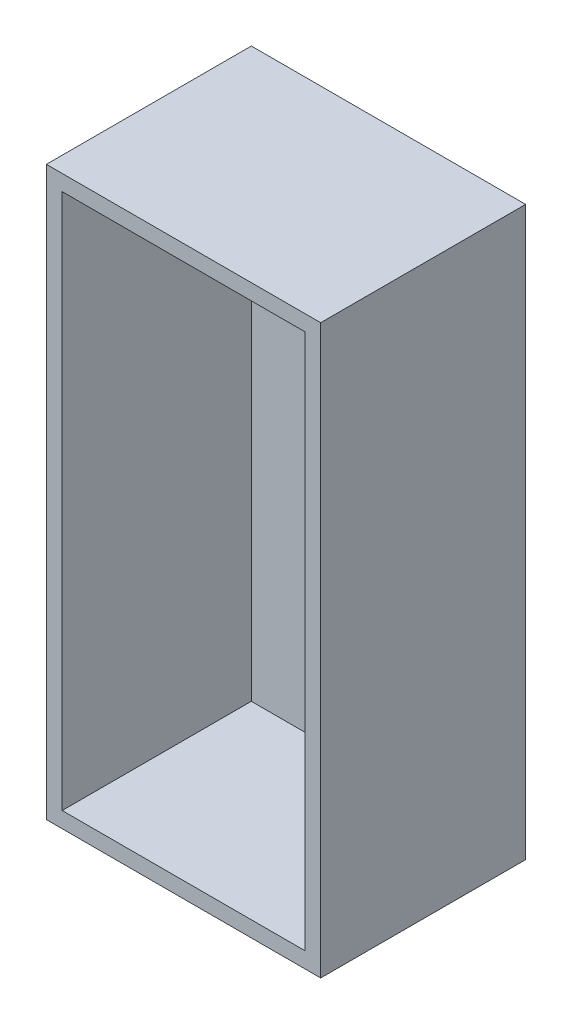
ISO-10303-21;
HEADER;
FILE_DESCRIPTION(('STEP AP214'),'2;1');
FILE_NAME('part.step','',(''),(''),'','','');
FILE_SCHEMA(('AUTOMOTIVE_DESIGN { 1 0 10303 214 1 1 1 1 }'));
ENDSEC;
DATA;
#1=APPLICATION_CONTEXT('core data for automotive mechanical design processes');
#2=APPLICATION_PROTOCOL_DEFINITION('international standard','automotive_design',2000,#1);
#3=PRODUCT_CONTEXT('',#1,'mechanical');
#4=PRODUCT('Part','Part','',(#3));
#5=PRODUCT_RELATED_PRODUCT_CATEGORY('part','',(#4));
#6=PRODUCT_DEFINITION_FORMATION('','',#4);
#7=PRODUCT_DEFINITION_CONTEXT('part definition',#1,'design');
#8=PRODUCT_DEFINITION('design','',#6,#7);
#9=PRODUCT_DEFINITION_SHAPE('','',#8);
#10=(LENGTH_UNIT() NAMED_UNIT(*) SI_UNIT(.MILLI.,.METRE.));
#11=(NAMED_UNIT(*) PLANE_ANGLE_UNIT() SI_UNIT($,.RADIAN.));
#12=(NAMED_UNIT(*) SI_UNIT($,.STERADIAN.) SOLID_ANGLE_UNIT());
#13=UNCERTAINTY_MEASURE_WITH_UNIT(LENGTH_MEASURE(1.E-05),#10,'distance_accuracy_value','');
#14=(GEOMETRIC_REPRESENTATION_CONTEXT(3) GLOBAL_UNCERTAINTY_ASSIGNED_CONTEXT((#13)) GLOBAL_UNIT_ASSIGNED_CONTEXT((#10,
#11,#12)) REPRESENTATION_CONTEXT('',''));
#15=CARTESIAN_POINT('',(0.,0.,0.));
#16=DIRECTION('',(0.,0.,1.));
#17=DIRECTION('',(1.,0.,0.));
#18=AXIS2_PLACEMENT_3D('',#15,#16,#17);
#19=CARTESIAN_POINT('',(43.5,90.,32.5));
#20=DIRECTION('',(0.,0.,-1.));
#21=DIRECTION('',(-1.,0.,0.));
#22=AXIS2_PLACEMENT_3D('',#19,#20,#21);
#23=PLANE('',#22);
#24=DIRECTION('',(1.,0.,0.));
#25=VECTOR('',#24,1.);
#26=CARTESIAN_POINT('',(43.5,-90.,32.5));
#27=LINE('',#26,#25);
#28=CARTESIAN_POINT('',(-43.5,-90.,32.5));
#29=VERTEX_POINT('',#28);
#30=CARTESIAN_POINT('',(43.5,-90.,32.5));
#31=VERTEX_POINT('',#30);
#32=EDGE_CURVE('E162',#29,#31,#27,.T.);
#33=ORIENTED_EDGE('',*,*,#32,.T.);
#34=DIRECTION('',(0.,-1.,0.));
#35=VECTOR('',#34,1.);
#36=CARTESIAN_POINT('',(43.5,90.,32.5));
#37=LINE('',#36,#35);
#38=CARTESIAN_POINT('',(43.5,90.,32.5));
#39=VERTEX_POINT('',#38);
#40=EDGE_CURVE('E47',#39,#31,#37,.T.);
#41=ORIENTED_EDGE('',*,*,#40,.F.);
#42=DIRECTION('',(1.,0.,0.));
#43=VECTOR('',#42,1.);
#44=CARTESIAN_POINT('',(43.5,90.,32.5));
#45=LINE('',#44,#43);
#46=CARTESIAN_POINT('',(-43.5,90.,32.5));
#47=VERTEX_POINT('',#46);
#48=EDGE_CURVE('E91',#47,#39,#45,.T.);
#49=ORIENTED_EDGE('',*,*,#48,.F.);
#50=DIRECTION('',(0.,-1.,0.));
#51=VECTOR('',#50,1.);
#52=CARTESIAN_POINT('',(-43.5,90.,32.5));
#53=LINE('',#52,#51);
#54=EDGE_CURVE('E11',#47,#29,#53,.T.);
#55=ORIENTED_EDGE('',*,*,#54,.T.);
#56=EDGE_LOOP('',(#33,#41,#49,#55));
#57=FACE_BOUND('',#56,.T.);
#58=DIRECTION('',(1.,0.,0.));
#59=VECTOR('',#58,1.);
#60=CARTESIAN_POINT('',(43.5,-85.,32.5));
#61=LINE('',#60,#59);
#62=CARTESIAN_POINT('',(-38.5,-85.,32.5));
#63=VERTEX_POINT('',#62);
#64=CARTESIAN_POINT('',(38.5,-85.,32.5));
#65=VERTEX_POINT('',#64);
#66=EDGE_CURVE('E135',#63,#65,#61,.T.);
#67=ORIENTED_EDGE('',*,*,#66,.F.);
#68=DIRECTION('',(0.,-1.,0.));
#69=VECTOR('',#68,1.);
#70=CARTESIAN_POINT('',(-38.5,90.,32.5));
#71=LINE('',#70,#69);
#72=CARTESIAN_POINT('',(-38.5,85.,32.5));
#73=VERTEX_POINT('',#72);
#74=EDGE_CURVE('E134',#73,#63,#71,.T.);
#75=ORIENTED_EDGE('',*,*,#74,.F.);
#76=DIRECTION('',(1.,0.,0.));
#77=VECTOR('',#76,1.);
#78=CARTESIAN_POINT('',(43.5,85.,32.5));
#79=LINE('',#78,#77);
#80=CARTESIAN_POINT('',(38.5,85.,32.5));
#81=VERTEX_POINT('',#80);
#82=EDGE_CURVE('E139',#73,#81,#79,.T.);
#83=ORIENTED_EDGE('',*,*,#82,.T.);
#84=DIRECTION('',(0.,-1.,0.));
#85=VECTOR('',#84,1.);
#86=CARTESIAN_POINT('',(38.5,90.,32.5));
#87=LINE('',#86,#85);
#88=EDGE_CURVE('E144',#81,#65,#87,.T.);
#89=ORIENTED_EDGE('',*,*,#88,.T.);
#90=EDGE_LOOP('',(#67,#75,#83,#89));
#91=FACE_BOUND('',#90,.T.);
#92=ADVANCED_FACE('F39',(#57,#91),#23,.F.);
#93=CARTESIAN_POINT('',(-43.5,90.,32.5));
#94=DIRECTION('',(1.,0.,0.));
#95=DIRECTION('',(0.,0.,-1.));
#96=AXIS2_PLACEMENT_3D('',#93,#94,#95);
#97=PLANE('',#96);
#98=DIRECTION('',(0.,0.,1.));
#99=VECTOR('',#98,1.);
#100=CARTESIAN_POINT('',(-43.5,-90.,32.5));
#101=LINE('',#100,#99);
#102=CARTESIAN_POINT('',(-43.5,-90.,-32.5));
#103=VERTEX_POINT('',#102);
#104=EDGE_CURVE('E147',#103,#29,#101,.T.);
#105=ORIENTED_EDGE('',*,*,#104,.T.);
#106=ORIENTED_EDGE('',*,*,#54,.F.);
#107=DIRECTION('',(0.,0.,1.));
#108=VECTOR('',#107,1.);
#109=CARTESIAN_POINT('',(-43.5,90.,32.5));
#110=LINE('',#109,#108);
#111=CARTESIAN_POINT('',(-43.5,90.,-32.5));
#112=VERTEX_POINT('',#111);
#113=EDGE_CURVE('E153',#112,#47,#110,.T.);
#114=ORIENTED_EDGE('',*,*,#113,.F.);
#115=DIRECTION('',(0.,-1.,0.));
#116=VECTOR('',#115,1.);
#117=CARTESIAN_POINT('',(-43.5,90.,-32.5));
#118=LINE('',#117,#116);
#119=EDGE_CURVE('E159',#112,#103,#118,.T.);
#120=ORIENTED_EDGE('',*,*,#119,.T.);
#121=EDGE_LOOP('',(#105,#106,#114,#120));
#122=FACE_BOUND('',#121,.T.);
#123=ADVANCED_FACE('F41',(#122),#97,.F.);
#124=CARTESIAN_POINT('',(43.5,90.,32.5));
#125=DIRECTION('',(-1.,0.,0.));
#126=DIRECTION('',(0.,0.,1.));
#127=AXIS2_PLACEMENT_3D('',#124,#125,#126);
#128=PLANE('',#127);
#129=DIRECTION('',(0.,0.,-1.));
#130=VECTOR('',#129,1.);
#131=CARTESIAN_POINT('',(43.5,-90.,32.5));
#132=LINE('',#131,#130);
#133=CARTESIAN_POINT('',(43.5,-90.,-32.5));
#134=VERTEX_POINT('',#133);
#135=EDGE_CURVE('E164',#31,#134,#132,.T.);
#136=ORIENTED_EDGE('',*,*,#135,.T.);
#137=DIRECTION('',(0.,-1.,0.));
#138=VECTOR('',#137,1.);
#139=CARTESIAN_POINT('',(43.5,90.,-32.5));
#140=LINE('',#139,#138);
#141=CARTESIAN_POINT('',(43.5,90.,-32.5));
#142=VERTEX_POINT('',#141);
#143=EDGE_CURVE('E168',#142,#134,#140,.T.);
#144=ORIENTED_EDGE('',*,*,#143,.F.);
#145=DIRECTION('',(0.,0.,-1.));
#146=VECTOR('',#145,1.);
#147=CARTESIAN_POINT('',(43.5,90.,32.5));
#148=LINE('',#147,#146);
#149=EDGE_CURVE('E156',#39,#142,#148,.T.);
#150=ORIENTED_EDGE('',*,*,#149,.F.);
#151=ORIENTED_EDGE('',*,*,#40,.T.);
#152=EDGE_LOOP('',(#136,#144,#150,#151));
#153=FACE_BOUND('',#152,.T.);
#154=ADVANCED_FACE('F173',(#153),#128,.F.);
#155=CARTESIAN_POINT('',(43.5,90.,-32.5));
#156=DIRECTION('',(0.,0.,1.));
#157=DIRECTION('',(1.,0.,0.));
#158=AXIS2_PLACEMENT_3D('',#155,#156,#157);
#159=PLANE('',#158);
#160=DIRECTION('',(-1.,0.,0.));
#161=VECTOR('',#160,1.);
#162=CARTESIAN_POINT('',(43.5,-90.,-32.5));
#163=LINE('',#162,#161);
#164=EDGE_CURVE('E84',#134,#103,#163,.T.);
#165=ORIENTED_EDGE('',*,*,#164,.T.);
#166=ORIENTED_EDGE('',*,*,#119,.F.);
#167=DIRECTION('',(-1.,0.,0.));
#168=VECTOR('',#167,1.);
#169=CARTESIAN_POINT('',(43.5,90.,-32.5));
#170=LINE('',#169,#168);
#171=EDGE_CURVE('E63',#142,#112,#170,.T.);
#172=ORIENTED_EDGE('',*,*,#171,.F.);
#173=ORIENTED_EDGE('',*,*,#143,.T.);
#174=EDGE_LOOP('',(#165,#166,#172,#173));
#175=FACE_BOUND('',#174,.T.);
#176=ADVANCED_FACE('F181',(#175),#159,.F.);
#177=CARTESIAN_POINT('',(0.,90.,0.));
#178=DIRECTION('',(0.,1.,0.));
#179=DIRECTION('',(0.,0.,1.));
#180=AXIS2_PLACEMENT_3D('',#177,#178,#179);
#181=PLANE('',#180);
#182=ORIENTED_EDGE('',*,*,#113,.T.);
#183=ORIENTED_EDGE('',*,*,#48,.T.);
#184=ORIENTED_EDGE('',*,*,#149,.T.);
#185=ORIENTED_EDGE('',*,*,#171,.T.);
#186=EDGE_LOOP('',(#182,#183,#184,#185));
#187=FACE_BOUND('',#186,.T.);
#188=ADVANCED_FACE('F183',(#187),#181,.T.);
#189=CARTESIAN_POINT('',(0.,-90.,0.));
#190=DIRECTION('',(0.,1.,0.));
#191=DIRECTION('',(0.,0.,1.));
#192=AXIS2_PLACEMENT_3D('',#189,#190,#191);
#193=PLANE('',#192);
#194=ORIENTED_EDGE('',*,*,#104,.F.);
#195=ORIENTED_EDGE('',*,*,#164,.F.);
#196=ORIENTED_EDGE('',*,*,#135,.F.);
#197=ORIENTED_EDGE('',*,*,#32,.F.);
#198=EDGE_LOOP('',(#194,#195,#196,#197));
#199=FACE_BOUND('',#198,.T.);
#200=ADVANCED_FACE('F177',(#199),#193,.F.);
#201=CARTESIAN_POINT('',(-38.5,90.,32.5));
#202=DIRECTION('',(1.,0.,0.));
#203=DIRECTION('',(0.,0.,-1.));
#204=AXIS2_PLACEMENT_3D('',#201,#202,#203);
#205=PLANE('',#204);
#206=DIRECTION('',(0.,0.,1.));
#207=VECTOR('',#206,1.);
#208=CARTESIAN_POINT('',(-38.5,-85.,32.5));
#209=LINE('',#208,#207);
#210=CARTESIAN_POINT('',(-38.5,-85.,-27.5));
#211=VERTEX_POINT('',#210);
#212=EDGE_CURVE('E118',#211,#63,#209,.T.);
#213=ORIENTED_EDGE('',*,*,#212,.F.);
#214=DIRECTION('',(0.,-1.,0.));
#215=VECTOR('',#214,1.);
#216=CARTESIAN_POINT('',(-38.5,90.,-27.5));
#217=LINE('',#216,#215);
#218=CARTESIAN_POINT('',(-38.5,85.,-27.5));
#219=VERTEX_POINT('',#218);
#220=EDGE_CURVE('E126',#219,#211,#217,.T.);
#221=ORIENTED_EDGE('',*,*,#220,.F.);
#222=DIRECTION('',(0.,0.,1.));
#223=VECTOR('',#222,1.);
#224=CARTESIAN_POINT('',(-38.5,85.,32.5));
#225=LINE('',#224,#223);
#226=EDGE_CURVE('E54',#219,#73,#225,.T.);
#227=ORIENTED_EDGE('',*,*,#226,.T.);
#228=ORIENTED_EDGE('',*,*,#74,.T.);
#229=EDGE_LOOP('',(#213,#221,#227,#228));
#230=FACE_BOUND('',#229,.T.);
#231=ADVANCED_FACE('F132',(#230),#205,.T.);
#232=CARTESIAN_POINT('',(38.5,90.,32.5));
#233=DIRECTION('',(-1.,0.,0.));
#234=DIRECTION('',(0.,0.,1.));
#235=AXIS2_PLACEMENT_3D('',#232,#233,#234);
#236=PLANE('',#235);
#237=DIRECTION('',(0.,0.,-1.));
#238=VECTOR('',#237,1.);
#239=CARTESIAN_POINT('',(38.5,-85.,32.5));
#240=LINE('',#239,#238);
#241=CARTESIAN_POINT('',(38.5,-85.,-27.5));
#242=VERTEX_POINT('',#241);
#243=EDGE_CURVE('E121',#65,#242,#240,.T.);
#244=ORIENTED_EDGE('',*,*,#243,.F.);
#245=ORIENTED_EDGE('',*,*,#88,.F.);
#246=DIRECTION('',(0.,0.,-1.));
#247=VECTOR('',#246,1.);
#248=CARTESIAN_POINT('',(38.5,85.,32.5));
#249=LINE('',#248,#247);
#250=CARTESIAN_POINT('',(38.5,85.,-27.5));
#251=VERTEX_POINT('',#250);
#252=EDGE_CURVE('E142',#81,#251,#249,.T.);
#253=ORIENTED_EDGE('',*,*,#252,.T.);
#254=DIRECTION('',(0.,-1.,0.));
#255=VECTOR('',#254,1.);
#256=CARTESIAN_POINT('',(38.5,90.,-27.5));
#257=LINE('',#256,#255);
#258=EDGE_CURVE('E130',#251,#242,#257,.T.);
#259=ORIENTED_EDGE('',*,*,#258,.T.);
#260=EDGE_LOOP('',(#244,#245,#253,#259));
#261=FACE_BOUND('',#260,.T.);
#262=ADVANCED_FACE('F200',(#261),#236,.T.);
#263=CARTESIAN_POINT('',(43.5,90.,-27.5));
#264=DIRECTION('',(0.,0.,1.));
#265=DIRECTION('',(1.,0.,0.));
#266=AXIS2_PLACEMENT_3D('',#263,#264,#265);
#267=PLANE('',#266);
#268=DIRECTION('',(-1.,0.,0.));
#269=VECTOR('',#268,1.);
#270=CARTESIAN_POINT('',(43.5,-85.,-27.5));
#271=LINE('',#270,#269);
#272=EDGE_CURVE('E114',#242,#211,#271,.T.);
#273=ORIENTED_EDGE('',*,*,#272,.F.);
#274=ORIENTED_EDGE('',*,*,#258,.F.);
#275=DIRECTION('',(-1.,0.,0.));
#276=VECTOR('',#275,1.);
#277=CARTESIAN_POINT('',(43.5,85.,-27.5));
#278=LINE('',#277,#276);
#279=EDGE_CURVE('E129',#251,#219,#278,.T.);
#280=ORIENTED_EDGE('',*,*,#279,.T.);
#281=ORIENTED_EDGE('',*,*,#220,.T.);
#282=EDGE_LOOP('',(#273,#274,#280,#281));
#283=FACE_BOUND('',#282,.T.);
#284=ADVANCED_FACE('F127',(#283),#267,.T.);
#285=CARTESIAN_POINT('',(0.,85.,0.));
#286=DIRECTION('',(0.,1.,0.));
#287=DIRECTION('',(0.,0.,1.));
#288=AXIS2_PLACEMENT_3D('',#285,#286,#287);
#289=PLANE('',#288);
#290=ORIENTED_EDGE('',*,*,#226,.F.);
#291=ORIENTED_EDGE('',*,*,#279,.F.);
#292=ORIENTED_EDGE('',*,*,#252,.F.);
#293=ORIENTED_EDGE('',*,*,#82,.F.);
#294=EDGE_LOOP('',(#290,#291,#292,#293));
#295=FACE_BOUND('',#294,.T.);
#296=ADVANCED_FACE('F203',(#295),#289,.F.);
#297=CARTESIAN_POINT('',(0.,-85.,0.));
#298=DIRECTION('',(0.,1.,0.));
#299=DIRECTION('',(0.,0.,1.));
#300=AXIS2_PLACEMENT_3D('',#297,#298,#299);
#301=PLANE('',#300);
#302=ORIENTED_EDGE('',*,*,#212,.T.);
#303=ORIENTED_EDGE('',*,*,#66,.T.);
#304=ORIENTED_EDGE('',*,*,#243,.T.);
#305=ORIENTED_EDGE('',*,*,#272,.T.);
#306=EDGE_LOOP('',(#302,#303,#304,#305));
#307=FACE_BOUND('',#306,.T.);
#308=ADVANCED_FACE('F116',(#307),#301,.T.);
#309=CLOSED_SHELL('',(#92,#123,#154,#176,#188,#200,#231,#262,#284,#296,#308));
#310=MANIFOLD_SOLID_BREP('B2',#309);
#311=ADVANCED_BREP_SHAPE_REPRESENTATION('',(#18,#310),#14);
#312=SHAPE_DEFINITION_REPRESENTATION(#9,#311);
ENDSEC;
END-ISO-10303-21;
